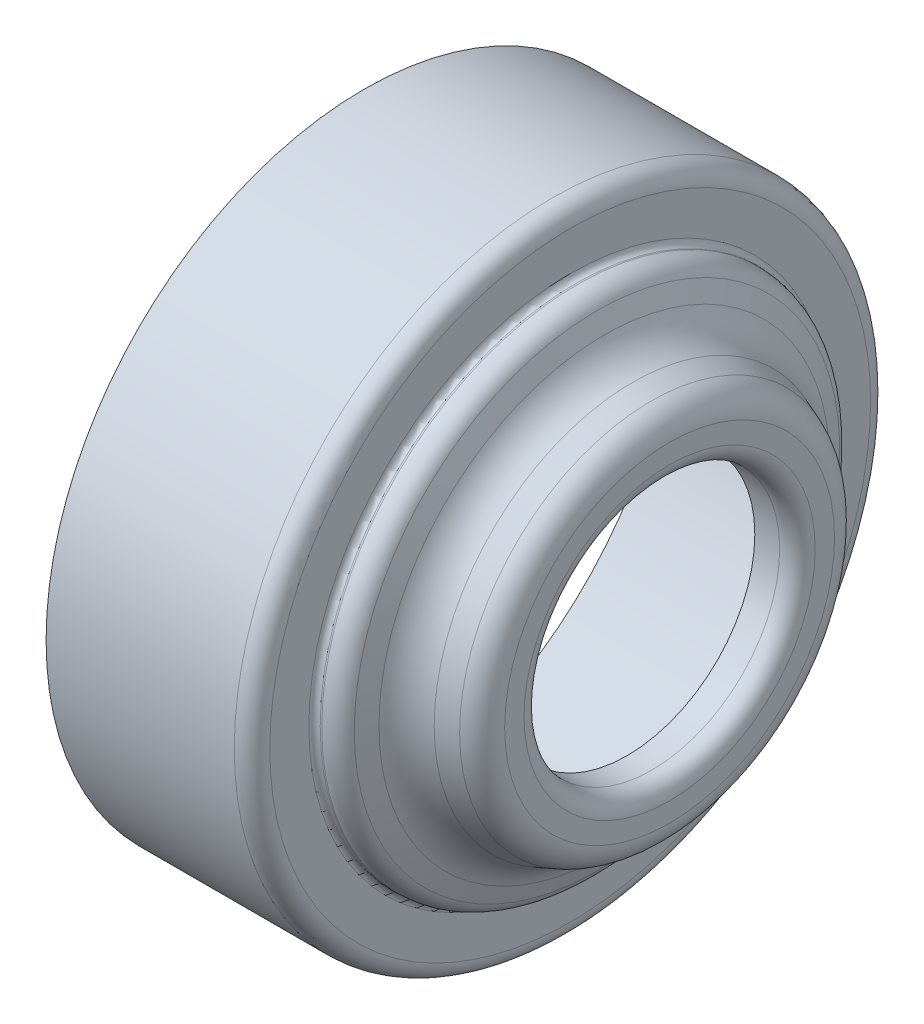
ISO-10303-21;
HEADER;
FILE_DESCRIPTION(('STEP AP214'),'2;1');
FILE_NAME('part.step','',(''),(''),'','','');
FILE_SCHEMA(('AUTOMOTIVE_DESIGN { 1 0 10303 214 1 1 1 1 }'));
ENDSEC;
DATA;
#1=APPLICATION_CONTEXT('core data for automotive mechanical design processes');
#2=APPLICATION_PROTOCOL_DEFINITION('international standard','automotive_design',2000,#1);
#3=PRODUCT_CONTEXT('',#1,'mechanical');
#4=PRODUCT('Part','Part','',(#3));
#5=PRODUCT_RELATED_PRODUCT_CATEGORY('part','',(#4));
#6=PRODUCT_DEFINITION_FORMATION('','',#4);
#7=PRODUCT_DEFINITION_CONTEXT('part definition',#1,'design');
#8=PRODUCT_DEFINITION('design','',#6,#7);
#9=PRODUCT_DEFINITION_SHAPE('','',#8);
#10=(LENGTH_UNIT() NAMED_UNIT(*) SI_UNIT(.MILLI.,.METRE.));
#11=(NAMED_UNIT(*) PLANE_ANGLE_UNIT() SI_UNIT($,.RADIAN.));
#12=(NAMED_UNIT(*) SI_UNIT($,.STERADIAN.) SOLID_ANGLE_UNIT());
#13=UNCERTAINTY_MEASURE_WITH_UNIT(LENGTH_MEASURE(1.E-05),#10,'distance_accuracy_value','');
#14=(GEOMETRIC_REPRESENTATION_CONTEXT(3) GLOBAL_UNCERTAINTY_ASSIGNED_CONTEXT((#13)) GLOBAL_UNIT_ASSIGNED_CONTEXT((#10,
#11,#12)) REPRESENTATION_CONTEXT('',''));
#15=CARTESIAN_POINT('',(0.,0.,0.));
#16=DIRECTION('',(0.,0.,1.));
#17=DIRECTION('',(1.,0.,0.));
#18=AXIS2_PLACEMENT_3D('',#15,#16,#17);
#19=CARTESIAN_POINT('',(-14.5,22.4,0.));
#20=DIRECTION('',(1.,0.,0.));
#21=DIRECTION('',(0.,0.,-1.));
#22=AXIS2_PLACEMENT_3D('',#19,#20,#21);
#23=PLANE('',#22);
#24=CARTESIAN_POINT('',(-14.5,0.,0.));
#25=DIRECTION('',(-1.,0.,0.));
#26=DIRECTION('',(0.,0.,1.));
#27=AXIS2_PLACEMENT_3D('',#24,#25,#26);
#28=CIRCLE('',#27,22.);
#29=CARTESIAN_POINT('',(-14.5,0.,22.));
#30=VERTEX_POINT('',#29);
#31=EDGE_CURVE('E10',#30,#30,#28,.T.);
#32=ORIENTED_EDGE('',*,*,#31,.F.);
#33=EDGE_LOOP('',(#32));
#34=FACE_BOUND('',#33,.T.);
#35=CARTESIAN_POINT('',(-14.5,0.,0.));
#36=DIRECTION('',(-1.,0.,0.));
#37=DIRECTION('',(0.,0.,1.));
#38=AXIS2_PLACEMENT_3D('',#35,#36,#37);
#39=CIRCLE('',#38,22.4);
#40=CARTESIAN_POINT('',(-14.5,0.,22.4));
#41=VERTEX_POINT('',#40);
#42=EDGE_CURVE('E123',#41,#41,#39,.T.);
#43=ORIENTED_EDGE('',*,*,#42,.T.);
#44=EDGE_LOOP('',(#43));
#45=FACE_BOUND('',#44,.T.);
#46=ADVANCED_FACE('F35',(#34,#45),#23,.F.);
#47=CARTESIAN_POINT('',(-28.9724854245721,0.,0.));
#48=DIRECTION('',(-1.,0.,0.));
#49=DIRECTION('',(0.,0.,1.));
#50=AXIS2_PLACEMENT_3D('',#47,#48,#49);
#51=CYLINDRICAL_SURFACE('',#50,22.);
#52=CARTESIAN_POINT('',(-1.25000000000001,0.,0.));
#53=DIRECTION('',(-1.,0.,0.));
#54=DIRECTION('',(0.,0.,1.));
#55=AXIS2_PLACEMENT_3D('',#52,#53,#54);
#56=CIRCLE('',#55,22.);
#57=CARTESIAN_POINT('',(-1.25000000000001,0.,22.));
#58=VERTEX_POINT('',#57);
#59=EDGE_CURVE('E41',#58,#58,#56,.T.);
#60=ORIENTED_EDGE('',*,*,#59,.F.);
#61=EDGE_LOOP('',(#60));
#62=FACE_BOUND('',#61,.T.);
#63=ORIENTED_EDGE('',*,*,#31,.T.);
#64=EDGE_LOOP('',(#63));
#65=FACE_BOUND('',#64,.T.);
#66=ADVANCED_FACE('F280',(#62,#65),#51,.F.);
#67=CARTESIAN_POINT('',(-1.25,0.,0.));
#68=DIRECTION('',(-1.,0.,0.));
#69=DIRECTION('',(0.,0.,1.));
#70=AXIS2_PLACEMENT_3D('',#67,#68,#69);
#71=TOROIDAL_SURFACE('',#70,21.15,0.85);
#72=CARTESIAN_POINT('',(-0.399999999999998,0.,0.));
#73=DIRECTION('',(-1.,0.,0.));
#74=DIRECTION('',(0.,0.,1.));
#75=AXIS2_PLACEMENT_3D('',#72,#73,#74);
#76=CIRCLE('',#75,21.15);
#77=CARTESIAN_POINT('',(-0.399999999999998,0.,21.15));
#78=VERTEX_POINT('',#77);
#79=EDGE_CURVE('E45',#78,#78,#76,.T.);
#80=ORIENTED_EDGE('',*,*,#79,.F.);
#81=EDGE_LOOP('',(#80));
#82=FACE_BOUND('',#81,.T.);
#83=ORIENTED_EDGE('',*,*,#59,.T.);
#84=EDGE_LOOP('',(#83));
#85=FACE_BOUND('',#84,.T.);
#86=ADVANCED_FACE('F275',(#82,#85),#71,.F.);
#87=CARTESIAN_POINT('',(-0.399999999999999,21.15,0.));
#88=DIRECTION('',(1.,0.,0.));
#89=DIRECTION('',(0.,0.,-1.));
#90=AXIS2_PLACEMENT_3D('',#87,#88,#89);
#91=PLANE('',#90);
#92=CARTESIAN_POINT('',(-0.400000000000001,0.,0.));
#93=DIRECTION('',(-1.,0.,0.));
#94=DIRECTION('',(0.,0.,1.));
#95=AXIS2_PLACEMENT_3D('',#92,#93,#94);
#96=CIRCLE('',#95,18.4);
#97=CARTESIAN_POINT('',(-0.400000000000001,0.,18.4));
#98=VERTEX_POINT('',#97);
#99=EDGE_CURVE('E49',#98,#98,#96,.T.);
#100=ORIENTED_EDGE('',*,*,#99,.F.);
#101=EDGE_LOOP('',(#100));
#102=FACE_BOUND('',#101,.T.);
#103=ORIENTED_EDGE('',*,*,#79,.T.);
#104=EDGE_LOOP('',(#103));
#105=FACE_BOUND('',#104,.T.);
#106=ADVANCED_FACE('F269',(#102,#105),#91,.F.);
#107=CARTESIAN_POINT('',(0.400000000000002,0.,0.));
#108=DIRECTION('',(-1.,0.,0.));
#109=DIRECTION('',(0.,0.,1.));
#110=AXIS2_PLACEMENT_3D('',#107,#108,#109);
#111=TOROIDAL_SURFACE('',#110,18.4,0.800000000000002);
#112=CARTESIAN_POINT('',(0.400000000000001,0.,0.));
#113=DIRECTION('',(-1.,0.,0.));
#114=DIRECTION('',(0.,0.,1.));
#115=AXIS2_PLACEMENT_3D('',#112,#113,#114);
#116=CIRCLE('',#115,17.6);
#117=CARTESIAN_POINT('',(0.400000000000001,0.,17.6));
#118=VERTEX_POINT('',#117);
#119=EDGE_CURVE('E54',#118,#118,#116,.T.);
#120=ORIENTED_EDGE('',*,*,#119,.F.);
#121=EDGE_LOOP('',(#120));
#122=FACE_BOUND('',#121,.T.);
#123=ORIENTED_EDGE('',*,*,#99,.T.);
#124=EDGE_LOOP('',(#123));
#125=FACE_BOUND('',#124,.T.);
#126=ADVANCED_FACE('F263',(#122,#125),#111,.T.);
#127=CARTESIAN_POINT('',(-28.9724854245721,0.,0.));
#128=DIRECTION('',(-1.,0.,0.));
#129=DIRECTION('',(0.,0.,1.));
#130=AXIS2_PLACEMENT_3D('',#127,#128,#129);
#131=CYLINDRICAL_SURFACE('',#130,17.6);
#132=CARTESIAN_POINT('',(0.510905763029156,0.,0.));
#133=DIRECTION('',(-1.,0.,0.));
#134=DIRECTION('',(0.,0.,1.));
#135=AXIS2_PLACEMENT_3D('',#132,#133,#134);
#136=CIRCLE('',#135,17.6);
#137=CARTESIAN_POINT('',(0.510905763029156,0.,17.6));
#138=VERTEX_POINT('',#137);
#139=EDGE_CURVE('E57',#138,#138,#136,.T.);
#140=ORIENTED_EDGE('',*,*,#139,.F.);
#141=EDGE_LOOP('',(#140));
#142=FACE_BOUND('',#141,.T.);
#143=ORIENTED_EDGE('',*,*,#119,.T.);
#144=EDGE_LOOP('',(#143));
#145=FACE_BOUND('',#144,.T.);
#146=ADVANCED_FACE('F257',(#142,#145),#131,.F.);
#147=CARTESIAN_POINT('',(0.510905763029164,0.,0.));
#148=DIRECTION('',(-1.,0.,0.));
#149=DIRECTION('',(0.,0.,1.));
#150=AXIS2_PLACEMENT_3D('',#147,#148,#149);
#151=TOROIDAL_SURFACE('',#150,16.5,1.1);
#152=CARTESIAN_POINT('',(1.52196529604903,0.,0.));
#153=DIRECTION('',(-1.,0.,0.));
#154=DIRECTION('',(0.,0.,1.));
#155=AXIS2_PLACEMENT_3D('',#152,#153,#154);
#156=CIRCLE('',#155,16.9333112284371);
#157=CARTESIAN_POINT('',(1.52196529604903,0.,16.9333112284371));
#158=VERTEX_POINT('',#157);
#159=EDGE_CURVE('E60',#158,#158,#156,.T.);
#160=ORIENTED_EDGE('',*,*,#159,.F.);
#161=EDGE_LOOP('',(#160));
#162=FACE_BOUND('',#161,.T.);
#163=ORIENTED_EDGE('',*,*,#139,.T.);
#164=EDGE_LOOP('',(#163));
#165=FACE_BOUND('',#164,.T.);
#166=ADVANCED_FACE('F251',(#162,#165),#151,.F.);
#167=CARTESIAN_POINT('',(1.52196529604903,0.,0.));
#168=DIRECTION('',(-1.,0.,0.));
#169=DIRECTION('',(0.,0.,1.));
#170=AXIS2_PLACEMENT_3D('',#167,#168,#169);
#171=CONICAL_SURFACE('',#170,16.9333112284371,1.16590454050981);
#172=CARTESIAN_POINT('',(2.04362390714991,0.,0.));
#173=DIRECTION('',(-1.,0.,0.));
#174=DIRECTION('',(0.,0.,1.));
#175=AXIS2_PLACEMENT_3D('',#172,#173,#174);
#176=CIRCLE('',#175,15.716107802535);
#177=CARTESIAN_POINT('',(2.04362390714991,0.,15.716107802535));
#178=VERTEX_POINT('',#177);
#179=EDGE_CURVE('E63',#178,#178,#176,.T.);
#180=ORIENTED_EDGE('',*,*,#179,.F.);
#181=EDGE_LOOP('',(#180));
#182=FACE_BOUND('',#181,.T.);
#183=ORIENTED_EDGE('',*,*,#159,.T.);
#184=EDGE_LOOP('',(#183));
#185=FACE_BOUND('',#184,.T.);
#186=ADVANCED_FACE('F245',(#182,#185),#171,.F.);
#187=CARTESIAN_POINT('',(5.62828952422033,0.,0.));
#188=DIRECTION('',(-1.,0.,0.));
#189=DIRECTION('',(0.,0.,1.));
#190=AXIS2_PLACEMENT_3D('',#187,#188,#189);
#191=TOROIDAL_SURFACE('',#190,17.2523930669938,3.9);
#192=CARTESIAN_POINT('',(4.2589081020256,0.,0.));
#193=DIRECTION('',(-1.,0.,0.));
#194=DIRECTION('',(0.,0.,1.));
#195=AXIS2_PLACEMENT_3D('',#192,#193,#194);
#196=CIRCLE('',#195,13.6007092744745);
#197=CARTESIAN_POINT('',(4.2589081020256,0.,13.6007092744745));
#198=VERTEX_POINT('',#197);
#199=EDGE_CURVE('E66',#198,#198,#196,.T.);
#200=ORIENTED_EDGE('',*,*,#199,.F.);
#201=EDGE_LOOP('',(#200));
#202=FACE_BOUND('',#201,.T.);
#203=ORIENTED_EDGE('',*,*,#179,.T.);
#204=EDGE_LOOP('',(#203));
#205=FACE_BOUND('',#204,.T.);
#206=ADVANCED_FACE('F239',(#202,#205),#191,.T.);
#207=CARTESIAN_POINT('',(4.2589081020256,0.,0.));
#208=DIRECTION('',(-1.,0.,0.));
#209=DIRECTION('',(0.,0.,1.));
#210=AXIS2_PLACEMENT_3D('',#207,#208,#209);
#211=CONICAL_SURFACE('',#210,13.6007092744745,0.358770670270572);
#212=CARTESIAN_POINT('',(5.56179750654143,0.,0.));
#213=DIRECTION('',(-1.,0.,0.));
#214=DIRECTION('',(0.,0.,1.));
#215=AXIS2_PLACEMENT_3D('',#212,#213,#214);
#216=CIRCLE('',#215,13.1121257477811);
#217=CARTESIAN_POINT('',(5.56179750654143,0.,13.1121257477811));
#218=VERTEX_POINT('',#217);
#219=EDGE_CURVE('E69',#218,#218,#216,.T.);
#220=ORIENTED_EDGE('',*,*,#219,.F.);
#221=EDGE_LOOP('',(#220));
#222=FACE_BOUND('',#221,.T.);
#223=ORIENTED_EDGE('',*,*,#199,.T.);
#224=EDGE_LOOP('',(#223));
#225=FACE_BOUND('',#224,.T.);
#226=ADVANCED_FACE('F233',(#222,#225),#211,.F.);
#227=CARTESIAN_POINT('',(5.,0.,0.));
#228=DIRECTION('',(-1.,0.,0.));
#229=DIRECTION('',(0.,0.,1.));
#230=AXIS2_PLACEMENT_3D('',#227,#228,#229);
#231=TOROIDAL_SURFACE('',#230,11.6139990636706,1.6);
#232=CARTESIAN_POINT('',(6.6,0.,0.));
#233=DIRECTION('',(-1.,0.,0.));
#234=DIRECTION('',(0.,0.,1.));
#235=AXIS2_PLACEMENT_3D('',#232,#233,#234);
#236=CIRCLE('',#235,11.6139990636706);
#237=CARTESIAN_POINT('',(6.6,0.,11.6139990636706));
#238=VERTEX_POINT('',#237);
#239=EDGE_CURVE('E72',#238,#238,#236,.T.);
#240=ORIENTED_EDGE('',*,*,#239,.F.);
#241=EDGE_LOOP('',(#240));
#242=FACE_BOUND('',#241,.T.);
#243=ORIENTED_EDGE('',*,*,#219,.T.);
#244=EDGE_LOOP('',(#243));
#245=FACE_BOUND('',#244,.T.);
#246=ADVANCED_FACE('F227',(#242,#245),#231,.F.);
#247=CARTESIAN_POINT('',(6.6,11.6139990636706,0.));
#248=DIRECTION('',(1.,0.,0.));
#249=DIRECTION('',(0.,0.,-1.));
#250=AXIS2_PLACEMENT_3D('',#247,#248,#249);
#251=PLANE('',#250);
#252=CARTESIAN_POINT('',(6.6,0.,0.));
#253=DIRECTION('',(-1.,0.,0.));
#254=DIRECTION('',(0.,0.,1.));
#255=AXIS2_PLACEMENT_3D('',#252,#253,#254);
#256=CIRCLE('',#255,10.25);
#257=CARTESIAN_POINT('',(6.6,0.,10.25));
#258=VERTEX_POINT('',#257);
#259=EDGE_CURVE('E75',#258,#258,#256,.T.);
#260=ORIENTED_EDGE('',*,*,#259,.F.);
#261=EDGE_LOOP('',(#260));
#262=FACE_BOUND('',#261,.T.);
#263=ORIENTED_EDGE('',*,*,#239,.T.);
#264=EDGE_LOOP('',(#263));
#265=FACE_BOUND('',#264,.T.);
#266=ADVANCED_FACE('F221',(#262,#265),#251,.F.);
#267=CARTESIAN_POINT('',(5.75,0.,0.));
#268=DIRECTION('',(-1.,0.,0.));
#269=DIRECTION('',(0.,0.,1.));
#270=AXIS2_PLACEMENT_3D('',#267,#268,#269);
#271=TOROIDAL_SURFACE('',#270,10.25,0.849999999999999);
#272=CARTESIAN_POINT('',(5.75000000000001,0.,0.));
#273=DIRECTION('',(-1.,0.,0.));
#274=DIRECTION('',(0.,0.,1.));
#275=AXIS2_PLACEMENT_3D('',#272,#273,#274);
#276=CIRCLE('',#275,9.4);
#277=CARTESIAN_POINT('',(5.75000000000001,0.,9.4));
#278=VERTEX_POINT('',#277);
#279=EDGE_CURVE('E78',#278,#278,#276,.T.);
#280=ORIENTED_EDGE('',*,*,#279,.F.);
#281=EDGE_LOOP('',(#280));
#282=FACE_BOUND('',#281,.T.);
#283=ORIENTED_EDGE('',*,*,#259,.T.);
#284=EDGE_LOOP('',(#283));
#285=FACE_BOUND('',#284,.T.);
#286=ADVANCED_FACE('F215',(#282,#285),#271,.F.);
#287=CARTESIAN_POINT('',(-28.9724854245721,0.,0.));
#288=DIRECTION('',(-1.,0.,0.));
#289=DIRECTION('',(0.,0.,1.));
#290=AXIS2_PLACEMENT_3D('',#287,#288,#289);
#291=CYLINDRICAL_SURFACE('',#290,9.4);
#292=CARTESIAN_POINT('',(4.,0.,0.));
#293=DIRECTION('',(-1.,0.,0.));
#294=DIRECTION('',(0.,0.,1.));
#295=AXIS2_PLACEMENT_3D('',#292,#293,#294);
#296=CIRCLE('',#295,9.4);
#297=CARTESIAN_POINT('',(4.,0.,9.4));
#298=VERTEX_POINT('',#297);
#299=EDGE_CURVE('E81',#298,#298,#296,.T.);
#300=ORIENTED_EDGE('',*,*,#299,.F.);
#301=EDGE_LOOP('',(#300));
#302=FACE_BOUND('',#301,.T.);
#303=ORIENTED_EDGE('',*,*,#279,.T.);
#304=EDGE_LOOP('',(#303));
#305=FACE_BOUND('',#304,.T.);
#306=ADVANCED_FACE('F209',(#302,#305),#291,.T.);
#307=CARTESIAN_POINT('',(4.,9.4,0.));
#308=DIRECTION('',(1.,0.,0.));
#309=DIRECTION('',(0.,0.,-1.));
#310=AXIS2_PLACEMENT_3D('',#307,#308,#309);
#311=PLANE('',#310);
#312=CARTESIAN_POINT('',(4.,0.,0.));
#313=DIRECTION('',(-1.,0.,0.));
#314=DIRECTION('',(0.,0.,1.));
#315=AXIS2_PLACEMENT_3D('',#312,#313,#314);
#316=CIRCLE('',#315,9.);
#317=CARTESIAN_POINT('',(4.,0.,9.));
#318=VERTEX_POINT('',#317);
#319=EDGE_CURVE('E84',#318,#318,#316,.T.);
#320=ORIENTED_EDGE('',*,*,#319,.F.);
#321=EDGE_LOOP('',(#320));
#322=FACE_BOUND('',#321,.T.);
#323=ORIENTED_EDGE('',*,*,#299,.T.);
#324=EDGE_LOOP('',(#323));
#325=FACE_BOUND('',#324,.T.);
#326=ADVANCED_FACE('F203',(#322,#325),#311,.F.);
#327=CARTESIAN_POINT('',(-28.9724854245721,0.,0.));
#328=DIRECTION('',(-1.,0.,0.));
#329=DIRECTION('',(0.,0.,1.));
#330=AXIS2_PLACEMENT_3D('',#327,#328,#329);
#331=CYLINDRICAL_SURFACE('',#330,9.);
#332=CARTESIAN_POINT('',(5.75000000000001,0.,0.));
#333=DIRECTION('',(-1.,0.,0.));
#334=DIRECTION('',(0.,0.,1.));
#335=AXIS2_PLACEMENT_3D('',#332,#333,#334);
#336=CIRCLE('',#335,9.);
#337=CARTESIAN_POINT('',(5.75000000000001,0.,9.));
#338=VERTEX_POINT('',#337);
#339=EDGE_CURVE('E87',#338,#338,#336,.T.);
#340=ORIENTED_EDGE('',*,*,#339,.F.);
#341=EDGE_LOOP('',(#340));
#342=FACE_BOUND('',#341,.T.);
#343=ORIENTED_EDGE('',*,*,#319,.T.);
#344=EDGE_LOOP('',(#343));
#345=FACE_BOUND('',#344,.T.);
#346=ADVANCED_FACE('F197',(#342,#345),#331,.F.);
#347=CARTESIAN_POINT('',(5.75,0.,0.));
#348=DIRECTION('',(-1.,0.,0.));
#349=DIRECTION('',(0.,0.,1.));
#350=AXIS2_PLACEMENT_3D('',#347,#348,#349);
#351=TOROIDAL_SURFACE('',#350,10.25,1.25);
#352=CARTESIAN_POINT('',(7.00000000000001,0.,0.));
#353=DIRECTION('',(-1.,0.,0.));
#354=DIRECTION('',(0.,0.,1.));
#355=AXIS2_PLACEMENT_3D('',#352,#353,#354);
#356=CIRCLE('',#355,10.25);
#357=CARTESIAN_POINT('',(7.00000000000001,0.,10.25));
#358=VERTEX_POINT('',#357);
#359=EDGE_CURVE('E90',#358,#358,#356,.T.);
#360=ORIENTED_EDGE('',*,*,#359,.F.);
#361=EDGE_LOOP('',(#360));
#362=FACE_BOUND('',#361,.T.);
#363=ORIENTED_EDGE('',*,*,#339,.T.);
#364=EDGE_LOOP('',(#363));
#365=FACE_BOUND('',#364,.T.);
#366=ADVANCED_FACE('F191',(#362,#365),#351,.T.);
#367=CARTESIAN_POINT('',(7.,11.6139990636706,0.));
#368=DIRECTION('',(-1.,0.,0.));
#369=DIRECTION('',(0.,0.,1.));
#370=AXIS2_PLACEMENT_3D('',#367,#368,#369);
#371=PLANE('',#370);
#372=CARTESIAN_POINT('',(7.,0.,0.));
#373=DIRECTION('',(-1.,0.,0.));
#374=DIRECTION('',(0.,0.,1.));
#375=AXIS2_PLACEMENT_3D('',#372,#373,#374);
#376=CIRCLE('',#375,11.6139990636706);
#377=CARTESIAN_POINT('',(7.,0.,11.6139990636706));
#378=VERTEX_POINT('',#377);
#379=EDGE_CURVE('E93',#378,#378,#376,.T.);
#380=ORIENTED_EDGE('',*,*,#379,.F.);
#381=EDGE_LOOP('',(#380));
#382=FACE_BOUND('',#381,.T.);
#383=ORIENTED_EDGE('',*,*,#359,.T.);
#384=EDGE_LOOP('',(#383));
#385=FACE_BOUND('',#384,.T.);
#386=ADVANCED_FACE('F185',(#382,#385),#371,.F.);
#387=CARTESIAN_POINT('',(5.,0.,0.));
#388=DIRECTION('',(-1.,0.,0.));
#389=DIRECTION('',(0.,0.,1.));
#390=AXIS2_PLACEMENT_3D('',#387,#388,#389);
#391=TOROIDAL_SURFACE('',#390,11.6139990636706,2.);
#392=CARTESIAN_POINT('',(5.70224688317678,0.,0.));
#393=DIRECTION('',(-1.,0.,0.));
#394=DIRECTION('',(0.,0.,1.));
#395=AXIS2_PLACEMENT_3D('',#392,#393,#394);
#396=CIRCLE('',#395,13.4866574188087);
#397=CARTESIAN_POINT('',(5.70224688317678,0.,13.4866574188087));
#398=VERTEX_POINT('',#397);
#399=EDGE_CURVE('E96',#398,#398,#396,.T.);
#400=ORIENTED_EDGE('',*,*,#399,.F.);
#401=EDGE_LOOP('',(#400));
#402=FACE_BOUND('',#401,.T.);
#403=ORIENTED_EDGE('',*,*,#379,.T.);
#404=EDGE_LOOP('',(#403));
#405=FACE_BOUND('',#404,.T.);
#406=ADVANCED_FACE('F179',(#402,#405),#391,.T.);
#407=CARTESIAN_POINT('',(5.70224688317678,0.,0.));
#408=DIRECTION('',(-1.,0.,0.));
#409=DIRECTION('',(0.,0.,1.));
#410=AXIS2_PLACEMENT_3D('',#407,#408,#409);
#411=CONICAL_SURFACE('',#410,13.4866574188087,0.358770670270575);
#412=CARTESIAN_POINT('',(4.39935747866096,0.,0.));
#413=DIRECTION('',(-1.,0.,0.));
#414=DIRECTION('',(0.,0.,1.));
#415=AXIS2_PLACEMENT_3D('',#412,#413,#414);
#416=CIRCLE('',#415,13.9752409455021);
#417=CARTESIAN_POINT('',(4.39935747866096,0.,13.9752409455021));
#418=VERTEX_POINT('',#417);
#419=EDGE_CURVE('E99',#418,#418,#416,.T.);
#420=ORIENTED_EDGE('',*,*,#419,.F.);
#421=EDGE_LOOP('',(#420));
#422=FACE_BOUND('',#421,.T.);
#423=ORIENTED_EDGE('',*,*,#399,.T.);
#424=EDGE_LOOP('',(#423));
#425=FACE_BOUND('',#424,.T.);
#426=ADVANCED_FACE('F173',(#422,#425),#411,.T.);
#427=CARTESIAN_POINT('',(5.62828952422033,0.,0.));
#428=DIRECTION('',(-1.,0.,0.));
#429=DIRECTION('',(0.,0.,1.));
#430=AXIS2_PLACEMENT_3D('',#427,#428,#429);
#431=TOROIDAL_SURFACE('',#430,17.2523930669938,3.5);
#432=CARTESIAN_POINT('',(2.41128191915713,0.,0.));
#433=DIRECTION('',(-1.,0.,0.));
#434=DIRECTION('',(0.,0.,1.));
#435=AXIS2_PLACEMENT_3D('',#432,#433,#434);
#436=CIRCLE('',#435,15.8736755219667);
#437=CARTESIAN_POINT('',(2.41128191915713,0.,15.8736755219667));
#438=VERTEX_POINT('',#437);
#439=EDGE_CURVE('E102',#438,#438,#436,.T.);
#440=ORIENTED_EDGE('',*,*,#439,.F.);
#441=EDGE_LOOP('',(#440));
#442=FACE_BOUND('',#441,.T.);
#443=ORIENTED_EDGE('',*,*,#419,.T.);
#444=EDGE_LOOP('',(#443));
#445=FACE_BOUND('',#444,.T.);
#446=ADVANCED_FACE('F167',(#442,#445),#431,.F.);
#447=CARTESIAN_POINT('',(2.41128191915713,0.,0.));
#448=DIRECTION('',(-1.,0.,0.));
#449=DIRECTION('',(0.,0.,1.));
#450=AXIS2_PLACEMENT_3D('',#447,#448,#449);
#451=CONICAL_SURFACE('',#450,15.8736755219667,1.16590454050981);
#452=CARTESIAN_POINT('',(1.88962330805625,0.,0.));
#453=DIRECTION('',(-1.,0.,0.));
#454=DIRECTION('',(0.,0.,1.));
#455=AXIS2_PLACEMENT_3D('',#452,#453,#454);
#456=CIRCLE('',#455,17.0908789478687);
#457=CARTESIAN_POINT('',(1.88962330805625,0.,17.0908789478687));
#458=VERTEX_POINT('',#457);
#459=EDGE_CURVE('E105',#458,#458,#456,.T.);
#460=ORIENTED_EDGE('',*,*,#459,.F.);
#461=EDGE_LOOP('',(#460));
#462=FACE_BOUND('',#461,.T.);
#463=ORIENTED_EDGE('',*,*,#439,.T.);
#464=EDGE_LOOP('',(#463));
#465=FACE_BOUND('',#464,.T.);
#466=ADVANCED_FACE('F161',(#462,#465),#451,.T.);
#467=CARTESIAN_POINT('',(0.510905763029164,0.,0.));
#468=DIRECTION('',(-1.,0.,0.));
#469=DIRECTION('',(0.,0.,1.));
#470=AXIS2_PLACEMENT_3D('',#467,#468,#469);
#471=TOROIDAL_SURFACE('',#470,16.5,1.5);
#472=CARTESIAN_POINT('',(0.510905763029156,0.,0.));
#473=DIRECTION('',(-1.,0.,0.));
#474=DIRECTION('',(0.,0.,1.));
#475=AXIS2_PLACEMENT_3D('',#472,#473,#474);
#476=CIRCLE('',#475,18.);
#477=CARTESIAN_POINT('',(0.510905763029156,0.,18.));
#478=VERTEX_POINT('',#477);
#479=EDGE_CURVE('E108',#478,#478,#476,.T.);
#480=ORIENTED_EDGE('',*,*,#479,.F.);
#481=EDGE_LOOP('',(#480));
#482=FACE_BOUND('',#481,.T.);
#483=ORIENTED_EDGE('',*,*,#459,.T.);
#484=EDGE_LOOP('',(#483));
#485=FACE_BOUND('',#484,.T.);
#486=ADVANCED_FACE('F155',(#482,#485),#471,.T.);
#487=CARTESIAN_POINT('',(-28.9724854245721,0.,0.));
#488=DIRECTION('',(-1.,0.,0.));
#489=DIRECTION('',(0.,0.,1.));
#490=AXIS2_PLACEMENT_3D('',#487,#488,#489);
#491=CYLINDRICAL_SURFACE('',#490,18.);
#492=CARTESIAN_POINT('',(0.400000000000001,0.,0.));
#493=DIRECTION('',(-1.,0.,0.));
#494=DIRECTION('',(0.,0.,1.));
#495=AXIS2_PLACEMENT_3D('',#492,#493,#494);
#496=CIRCLE('',#495,18.);
#497=CARTESIAN_POINT('',(0.400000000000001,0.,18.));
#498=VERTEX_POINT('',#497);
#499=EDGE_CURVE('E111',#498,#498,#496,.T.);
#500=ORIENTED_EDGE('',*,*,#499,.F.);
#501=EDGE_LOOP('',(#500));
#502=FACE_BOUND('',#501,.T.);
#503=ORIENTED_EDGE('',*,*,#479,.T.);
#504=EDGE_LOOP('',(#503));
#505=FACE_BOUND('',#504,.T.);
#506=ADVANCED_FACE('F149',(#502,#505),#491,.T.);
#507=CARTESIAN_POINT('',(0.400000000000002,0.,0.));
#508=DIRECTION('',(-1.,0.,0.));
#509=DIRECTION('',(0.,0.,1.));
#510=AXIS2_PLACEMENT_3D('',#507,#508,#509);
#511=TOROIDAL_SURFACE('',#510,18.4,0.400000000000001);
#512=CARTESIAN_POINT('',(0.,0.,0.));
#513=DIRECTION('',(-1.,0.,0.));
#514=DIRECTION('',(0.,0.,1.));
#515=AXIS2_PLACEMENT_3D('',#512,#513,#514);
#516=CIRCLE('',#515,18.4);
#517=CARTESIAN_POINT('',(0.,0.,18.4));
#518=VERTEX_POINT('',#517);
#519=EDGE_CURVE('E114',#518,#518,#516,.T.);
#520=ORIENTED_EDGE('',*,*,#519,.F.);
#521=EDGE_LOOP('',(#520));
#522=FACE_BOUND('',#521,.T.);
#523=ORIENTED_EDGE('',*,*,#499,.T.);
#524=EDGE_LOOP('',(#523));
#525=FACE_BOUND('',#524,.T.);
#526=ADVANCED_FACE('F143',(#522,#525),#511,.F.);
#527=CARTESIAN_POINT('',(0.,21.15,0.));
#528=DIRECTION('',(-1.,0.,0.));
#529=DIRECTION('',(0.,0.,1.));
#530=AXIS2_PLACEMENT_3D('',#527,#528,#529);
#531=PLANE('',#530);
#532=CARTESIAN_POINT('',(0.,0.,0.));
#533=DIRECTION('',(-1.,0.,0.));
#534=DIRECTION('',(0.,0.,1.));
#535=AXIS2_PLACEMENT_3D('',#532,#533,#534);
#536=CIRCLE('',#535,21.15);
#537=CARTESIAN_POINT('',(0.,0.,21.15));
#538=VERTEX_POINT('',#537);
#539=EDGE_CURVE('E117',#538,#538,#536,.T.);
#540=ORIENTED_EDGE('',*,*,#539,.F.);
#541=EDGE_LOOP('',(#540));
#542=FACE_BOUND('',#541,.T.);
#543=ORIENTED_EDGE('',*,*,#519,.T.);
#544=EDGE_LOOP('',(#543));
#545=FACE_BOUND('',#544,.T.);
#546=ADVANCED_FACE('F137',(#542,#545),#531,.F.);
#547=CARTESIAN_POINT('',(-1.25,0.,0.));
#548=DIRECTION('',(-1.,0.,0.));
#549=DIRECTION('',(0.,0.,1.));
#550=AXIS2_PLACEMENT_3D('',#547,#548,#549);
#551=TOROIDAL_SURFACE('',#550,21.15,1.25);
#552=CARTESIAN_POINT('',(-1.25000000000001,0.,0.));
#553=DIRECTION('',(-1.,0.,0.));
#554=DIRECTION('',(0.,0.,1.));
#555=AXIS2_PLACEMENT_3D('',#552,#553,#554);
#556=CIRCLE('',#555,22.4);
#557=CARTESIAN_POINT('',(-1.25000000000001,0.,22.4));
#558=VERTEX_POINT('',#557);
#559=EDGE_CURVE('E120',#558,#558,#556,.T.);
#560=ORIENTED_EDGE('',*,*,#559,.F.);
#561=EDGE_LOOP('',(#560));
#562=FACE_BOUND('',#561,.T.);
#563=ORIENTED_EDGE('',*,*,#539,.T.);
#564=EDGE_LOOP('',(#563));
#565=FACE_BOUND('',#564,.T.);
#566=ADVANCED_FACE('F131',(#562,#565),#551,.T.);
#567=CARTESIAN_POINT('',(-28.9724854245721,0.,0.));
#568=DIRECTION('',(-1.,0.,0.));
#569=DIRECTION('',(0.,0.,1.));
#570=AXIS2_PLACEMENT_3D('',#567,#568,#569);
#571=CYLINDRICAL_SURFACE('',#570,22.4);
#572=ORIENTED_EDGE('',*,*,#42,.F.);
#573=EDGE_LOOP('',(#572));
#574=FACE_BOUND('',#573,.T.);
#575=ORIENTED_EDGE('',*,*,#559,.T.);
#576=EDGE_LOOP('',(#575));
#577=FACE_BOUND('',#576,.T.);
#578=ADVANCED_FACE('F128',(#574,#577),#571,.T.);
#579=CLOSED_SHELL('',(#46,#66,#86,#106,#126,#146,#166,#186,#206,#226,#246,#266,#286,#306,#326,
#346,#366,#386,#406,#426,#446,#466,#486,#506,#526,#546,#566,#578));
#580=MANIFOLD_SOLID_BREP('B2',#579);
#581=ADVANCED_BREP_SHAPE_REPRESENTATION('',(#18,#580),#14);
#582=SHAPE_DEFINITION_REPRESENTATION(#9,#581);
ENDSEC;
END-ISO-10303-21;
